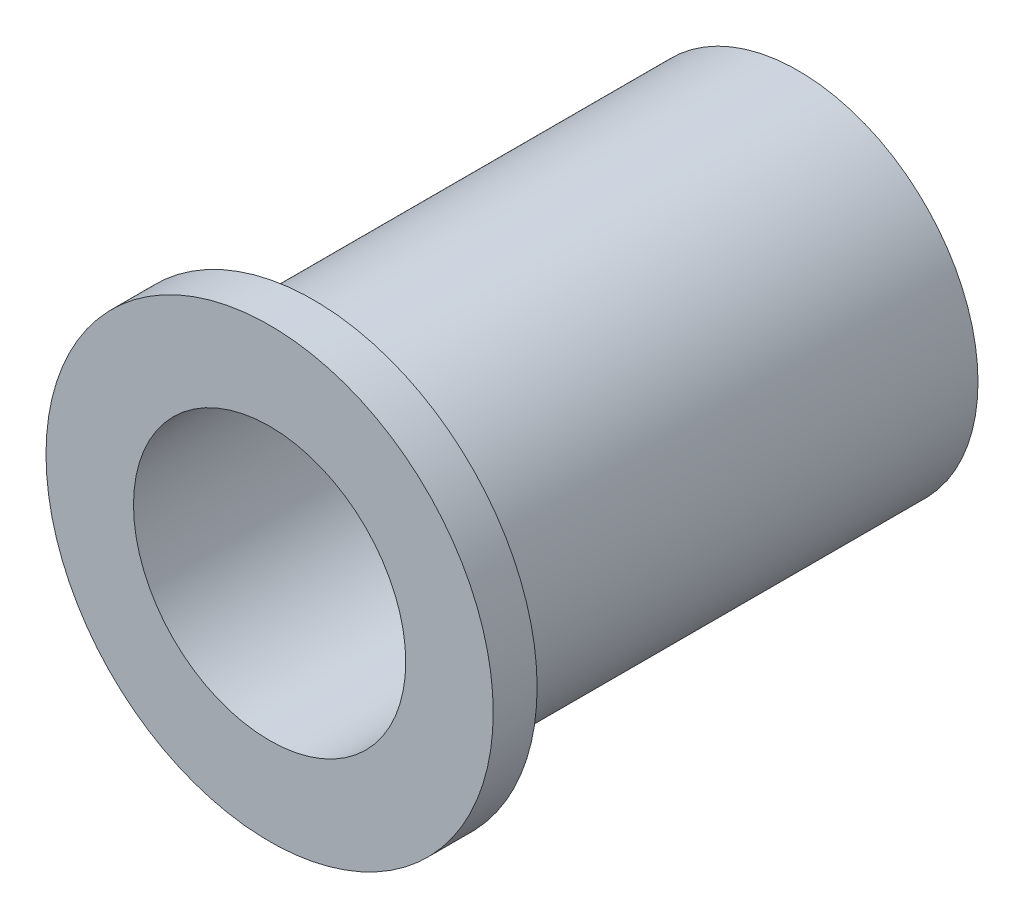
ISO-10303-21;
HEADER;
FILE_DESCRIPTION(('STEP AP214'),'2;1');
FILE_NAME('part.step','',(''),(''),'','','');
FILE_SCHEMA(('AUTOMOTIVE_DESIGN { 1 0 10303 214 1 1 1 1 }'));
ENDSEC;
DATA;
#1=APPLICATION_CONTEXT('core data for automotive mechanical design processes');
#2=APPLICATION_PROTOCOL_DEFINITION('international standard','automotive_design',2000,#1);
#3=PRODUCT_CONTEXT('',#1,'mechanical');
#4=PRODUCT('Part','Part','',(#3));
#5=PRODUCT_RELATED_PRODUCT_CATEGORY('part','',(#4));
#6=PRODUCT_DEFINITION_FORMATION('','',#4);
#7=PRODUCT_DEFINITION_CONTEXT('part definition',#1,'design');
#8=PRODUCT_DEFINITION('design','',#6,#7);
#9=PRODUCT_DEFINITION_SHAPE('','',#8);
#10=(LENGTH_UNIT() NAMED_UNIT(*) SI_UNIT(.MILLI.,.METRE.));
#11=(NAMED_UNIT(*) PLANE_ANGLE_UNIT() SI_UNIT($,.RADIAN.));
#12=(NAMED_UNIT(*) SI_UNIT($,.STERADIAN.) SOLID_ANGLE_UNIT());
#13=UNCERTAINTY_MEASURE_WITH_UNIT(LENGTH_MEASURE(1.E-05),#10,'distance_accuracy_value','');
#14=(GEOMETRIC_REPRESENTATION_CONTEXT(3) GLOBAL_UNCERTAINTY_ASSIGNED_CONTEXT((#13)) GLOBAL_UNIT_ASSIGNED_CONTEXT((#10,
#11,#12)) REPRESENTATION_CONTEXT('',''));
#15=CARTESIAN_POINT('',(0.,0.,0.));
#16=DIRECTION('',(0.,0.,1.));
#17=DIRECTION('',(1.,0.,0.));
#18=AXIS2_PLACEMENT_3D('',#15,#16,#17);
#19=CARTESIAN_POINT('',(0.,0.,-10.));
#20=DIRECTION('',(0.,0.,1.));
#21=DIRECTION('',(1.,0.,0.));
#22=AXIS2_PLACEMENT_3D('',#19,#20,#21);
#23=CYLINDRICAL_SURFACE('',#22,3.4);
#24=CARTESIAN_POINT('',(0.,0.,-2.7));
#25=DIRECTION('',(0.,0.,1.));
#26=DIRECTION('',(1.,0.,0.));
#27=AXIS2_PLACEMENT_3D('',#24,#25,#26);
#28=CIRCLE('',#27,3.4);
#29=CARTESIAN_POINT('',(3.4,0.,-2.7));
#30=VERTEX_POINT('',#29);
#31=EDGE_CURVE('E62',#30,#30,#28,.T.);
#32=ORIENTED_EDGE('',*,*,#31,.T.);
#33=EDGE_LOOP('',(#32));
#34=FACE_BOUND('',#33,.T.);
#35=CARTESIAN_POINT('',(0.,0.,6.47));
#36=DIRECTION('',(0.,0.,1.));
#37=DIRECTION('',(1.,0.,0.));
#38=AXIS2_PLACEMENT_3D('',#35,#36,#37);
#39=CIRCLE('',#38,3.4);
#40=CARTESIAN_POINT('',(3.4,0.,6.47));
#41=VERTEX_POINT('',#40);
#42=EDGE_CURVE('E350',#41,#41,#39,.T.);
#43=ORIENTED_EDGE('',*,*,#42,.F.);
#44=EDGE_LOOP('',(#43));
#45=FACE_BOUND('',#44,.T.);
#46=ADVANCED_FACE('F43',(#34,#45),#23,.T.);
#47=CARTESIAN_POINT('',(-7.99999999999999,0.,0.));
#48=DIRECTION('',(0.,0.,1.));
#49=DIRECTION('',(1.,0.,0.));
#50=AXIS2_PLACEMENT_3D('',#47,#48,#49);
#51=PLANE('',#50);
#52=CARTESIAN_POINT('',(-4.12912203114479E-11,0.,2.27606999878659E-11));
#53=DIRECTION('',(0.,0.,-1.));
#54=DIRECTION('',(-1.,0.,0.));
#55=AXIS2_PLACEMENT_3D('',#52,#53,#54);
#56=CIRCLE('',#55,2.49999999994088);
#57=CARTESIAN_POINT('',(-2.49999999998217,0.,2.27603938261662E-11));
#58=VERTEX_POINT('',#57);
#59=EDGE_CURVE('E50',#58,#58,#56,.T.);
#60=ORIENTED_EDGE('',*,*,#59,.T.);
#61=EDGE_LOOP('',(#60));
#62=FACE_BOUND('',#61,.T.);
#63=CARTESIAN_POINT('',(0.,0.,0.));
#64=DIRECTION('',(0.,0.,1.));
#65=DIRECTION('',(1.,0.,0.));
#66=AXIS2_PLACEMENT_3D('',#63,#64,#65);
#67=CIRCLE('',#66,2.575);
#68=CARTESIAN_POINT('',(2.575,0.,0.));
#69=VERTEX_POINT('',#68);
#70=EDGE_CURVE('E13',#69,#69,#67,.F.);
#71=ORIENTED_EDGE('',*,*,#70,.F.);
#72=EDGE_LOOP('',(#71));
#73=FACE_BOUND('',#72,.T.);
#74=ADVANCED_FACE('F45',(#62,#73),#51,.T.);
#75=CARTESIAN_POINT('',(-7.99999999999999,0.,-2.7));
#76=DIRECTION('',(0.,0.,1.));
#77=DIRECTION('',(1.,0.,0.));
#78=AXIS2_PLACEMENT_3D('',#75,#76,#77);
#79=PLANE('',#78);
#80=CARTESIAN_POINT('',(-4.12908896568121E-11,0.,-2.69999999997724));
#81=DIRECTION('',(0.,0.,-1.));
#82=DIRECTION('',(-1.,0.,0.));
#83=AXIS2_PLACEMENT_3D('',#80,#81,#82);
#84=CIRCLE('',#83,2.50000000004129);
#85=CARTESIAN_POINT('',(-2.50000000008258,0.,-2.69999999997724));
#86=VERTEX_POINT('',#85);
#87=EDGE_CURVE('E54',#86,#86,#84,.T.);
#88=ORIENTED_EDGE('',*,*,#87,.F.);
#89=EDGE_LOOP('',(#88));
#90=FACE_BOUND('',#89,.T.);
#91=ORIENTED_EDGE('',*,*,#31,.F.);
#92=EDGE_LOOP('',(#91));
#93=FACE_BOUND('',#92,.T.);
#94=ADVANCED_FACE('F127',(#90,#93),#79,.F.);
#95=CARTESIAN_POINT('',(-4.12912187561464E-11,0.,-0.0126999999565669));
#96=DIRECTION('',(0.,0.,1.));
#97=DIRECTION('',(1.,0.,0.));
#98=AXIS2_PLACEMENT_3D('',#95,#96,#97);
#99=CONICAL_SURFACE('',#98,2.48186252024745,0.959931089563941);
#100=ORIENTED_EDGE('',*,*,#59,.F.);
#101=EDGE_LOOP('',(#100));
#102=FACE_BOUND('',#101,.T.);
#103=CARTESIAN_POINT('',(-4.12912187561464E-11,0.,-0.0126999999565669));
#104=DIRECTION('',(0.,0.,-1.));
#105=DIRECTION('',(-1.,0.,0.));
#106=AXIS2_PLACEMENT_3D('',#103,#104,#105);
#107=CIRCLE('',#106,2.48186252024745);
#108=CARTESIAN_POINT('',(-2.48186252028874,0.,-0.0126999999565672));
#109=VERTEX_POINT('',#108);
#110=EDGE_CURVE('E64',#109,#109,#107,.T.);
#111=ORIENTED_EDGE('',*,*,#110,.T.);
#112=EDGE_LOOP('',(#111));
#113=FACE_BOUND('',#112,.T.);
#114=ADVANCED_FACE('F123',(#102,#113),#99,.F.);
#115=CARTESIAN_POINT('',(-4.12912203114479E-11,0.,2.27606999878659E-11));
#116=DIRECTION('',(0.,0.,-1.));
#117=DIRECTION('',(-1.,0.,0.));
#118=AXIS2_PLACEMENT_3D('',#115,#116,#117);
#119=CYLINDRICAL_SURFACE('',#118,2.50000000004129);
#120=CARTESIAN_POINT('',(-4.1290892767415E-11,0.,-2.67460000002466));
#121=DIRECTION('',(0.,0.,-1.));
#122=DIRECTION('',(-1.,0.,0.));
#123=AXIS2_PLACEMENT_3D('',#120,#121,#122);
#124=CIRCLE('',#123,2.50000000004129);
#125=CARTESIAN_POINT('',(-2.50000000008258,0.,-2.67460000002466));
#126=VERTEX_POINT('',#125);
#127=EDGE_CURVE('E59',#126,#126,#124,.T.);
#128=ORIENTED_EDGE('',*,*,#127,.F.);
#129=EDGE_LOOP('',(#128));
#130=FACE_BOUND('',#129,.T.);
#131=ORIENTED_EDGE('',*,*,#87,.T.);
#132=EDGE_LOOP('',(#131));
#133=FACE_BOUND('',#132,.T.);
#134=ADVANCED_FACE('F120',(#130,#133),#119,.F.);
#135=CARTESIAN_POINT('',(-4.1290892767415E-11,0.,-2.67460000002466));
#136=DIRECTION('',(0.,0.,-1.));
#137=DIRECTION('',(-1.,0.,0.));
#138=AXIS2_PLACEMENT_3D('',#135,#136,#137);
#139=CONICAL_SURFACE('',#138,2.50000000004129,0.959931088685206);
#140=CARTESIAN_POINT('',(-4.12909270676918E-11,0.,-2.39451698479343));
#141=DIRECTION('',(0.,0.,-1.));
#142=DIRECTION('',(-1.,0.,0.));
#143=AXIS2_PLACEMENT_3D('',#140,#141,#142);
#144=CIRCLE('',#143,2.10000000004129);
#145=CARTESIAN_POINT('',(-2.10000000008258,0.,-2.39451698479343));
#146=VERTEX_POINT('',#145);
#147=EDGE_CURVE('E113',#146,#146,#144,.T.);
#148=ORIENTED_EDGE('',*,*,#147,.F.);
#149=EDGE_LOOP('',(#148));
#150=FACE_BOUND('',#149,.T.);
#151=ORIENTED_EDGE('',*,*,#127,.T.);
#152=EDGE_LOOP('',(#151));
#153=FACE_BOUND('',#152,.T.);
#154=ADVANCED_FACE('F118',(#150,#153),#139,.F.);
#155=CARTESIAN_POINT('',(-4.12912203114479E-11,0.,2.27606999878659E-11));
#156=DIRECTION('',(0.,0.,-1.));
#157=DIRECTION('',(-1.,0.,0.));
#158=AXIS2_PLACEMENT_3D('',#155,#156,#157);
#159=CYLINDRICAL_SURFACE('',#158,2.10000000004129);
#160=CARTESIAN_POINT('',(-4.12909395754956E-11,0.,-2.29238301528389));
#161=DIRECTION('',(0.,0.,-1.));
#162=DIRECTION('',(-1.,0.,0.));
#163=AXIS2_PLACEMENT_3D('',#160,#161,#162);
#164=CIRCLE('',#163,2.10000000004129);
#165=CARTESIAN_POINT('',(-2.10000000008258,0.,-2.29238301528389));
#166=VERTEX_POINT('',#165);
#167=EDGE_CURVE('E110',#166,#166,#164,.T.);
#168=ORIENTED_EDGE('',*,*,#167,.F.);
#169=EDGE_LOOP('',(#168));
#170=FACE_BOUND('',#169,.T.);
#171=ORIENTED_EDGE('',*,*,#147,.T.);
#172=EDGE_LOOP('',(#171));
#173=FACE_BOUND('',#172,.T.);
#174=ADVANCED_FACE('F188',(#170,#173),#159,.F.);
#175=CARTESIAN_POINT('',(-4.12909395754956E-11,0.,-2.29238301528389));
#176=DIRECTION('',(0.,0.,1.));
#177=DIRECTION('',(1.,0.,0.));
#178=AXIS2_PLACEMENT_3D('',#175,#176,#177);
#179=CONICAL_SURFACE('',#178,2.10000000004129,0.959931088655895);
#180=CARTESIAN_POINT('',(-4.12909738757725E-11,0.,-2.01230000008651));
#181=DIRECTION('',(0.,0.,-1.));
#182=DIRECTION('',(-1.,0.,0.));
#183=AXIS2_PLACEMENT_3D('',#180,#181,#182);
#184=CIRCLE('',#183,2.49999999996799);
#185=CARTESIAN_POINT('',(-2.50000000000928,0.,-2.01230000008651));
#186=VERTEX_POINT('',#185);
#187=EDGE_CURVE('E107',#186,#186,#184,.T.);
#188=ORIENTED_EDGE('',*,*,#187,.F.);
#189=EDGE_LOOP('',(#188));
#190=FACE_BOUND('',#189,.T.);
#191=ORIENTED_EDGE('',*,*,#167,.T.);
#192=EDGE_LOOP('',(#191));
#193=FACE_BOUND('',#192,.T.);
#194=ADVANCED_FACE('F184',(#190,#193),#179,.F.);
#195=CARTESIAN_POINT('',(-4.12909738757725E-11,0.,-2.01230000008651));
#196=DIRECTION('',(0.,0.,-1.));
#197=DIRECTION('',(-1.,0.,0.));
#198=AXIS2_PLACEMENT_3D('',#195,#196,#197);
#199=CONICAL_SURFACE('',#198,2.49999999996799,0.959931088420655);
#200=CARTESIAN_POINT('',(-4.12910081760493E-11,0.,-1.7322169847489));
#201=DIRECTION('',(0.,0.,-1.));
#202=DIRECTION('',(-1.,0.,0.));
#203=AXIS2_PLACEMENT_3D('',#200,#201,#202);
#204=CIRCLE('',#203,2.10000000004129);
#205=CARTESIAN_POINT('',(-2.10000000008258,0.,-1.7322169847489));
#206=VERTEX_POINT('',#205);
#207=EDGE_CURVE('E104',#206,#206,#204,.T.);
#208=ORIENTED_EDGE('',*,*,#207,.F.);
#209=EDGE_LOOP('',(#208));
#210=FACE_BOUND('',#209,.T.);
#211=ORIENTED_EDGE('',*,*,#187,.T.);
#212=EDGE_LOOP('',(#211));
#213=FACE_BOUND('',#212,.T.);
#214=ADVANCED_FACE('F180',(#210,#213),#199,.F.);
#215=CARTESIAN_POINT('',(-4.12912203114479E-11,0.,2.27606999878659E-11));
#216=DIRECTION('',(0.,0.,-1.));
#217=DIRECTION('',(-1.,0.,0.));
#218=AXIS2_PLACEMENT_3D('',#215,#216,#217);
#219=CYLINDRICAL_SURFACE('',#218,2.10000000004129);
#220=CARTESIAN_POINT('',(-4.12910206838532E-11,0.,-1.63008301528389));
#221=DIRECTION('',(0.,0.,-1.));
#222=DIRECTION('',(-1.,0.,0.));
#223=AXIS2_PLACEMENT_3D('',#220,#221,#222);
#224=CIRCLE('',#223,2.10000000004129);
#225=CARTESIAN_POINT('',(-2.10000000008258,0.,-1.63008301528389));
#226=VERTEX_POINT('',#225);
#227=EDGE_CURVE('E101',#226,#226,#224,.T.);
#228=ORIENTED_EDGE('',*,*,#227,.F.);
#229=EDGE_LOOP('',(#228));
#230=FACE_BOUND('',#229,.T.);
#231=ORIENTED_EDGE('',*,*,#207,.T.);
#232=EDGE_LOOP('',(#231));
#233=FACE_BOUND('',#232,.T.);
#234=ADVANCED_FACE('F176',(#230,#233),#219,.F.);
#235=CARTESIAN_POINT('',(-4.12910206838532E-11,0.,-1.63008301528389));
#236=DIRECTION('',(0.,0.,1.));
#237=DIRECTION('',(1.,0.,0.));
#238=AXIS2_PLACEMENT_3D('',#235,#236,#237);
#239=CONICAL_SURFACE('',#238,2.10000000004129,0.959931088484176);
#240=CARTESIAN_POINT('',(-4.129105498413E-11,0.,-1.35000000001922));
#241=DIRECTION('',(0.,0.,-1.));
#242=DIRECTION('',(-1.,0.,0.));
#243=AXIS2_PLACEMENT_3D('',#240,#241,#242);
#244=CIRCLE('',#243,2.49999999991789);
#245=CARTESIAN_POINT('',(-2.49999999995918,0.,-1.35000000001922));
#246=VERTEX_POINT('',#245);
#247=EDGE_CURVE('E98',#246,#246,#244,.T.);
#248=ORIENTED_EDGE('',*,*,#247,.F.);
#249=EDGE_LOOP('',(#248));
#250=FACE_BOUND('',#249,.T.);
#251=ORIENTED_EDGE('',*,*,#227,.T.);
#252=EDGE_LOOP('',(#251));
#253=FACE_BOUND('',#252,.T.);
#254=ADVANCED_FACE('F172',(#250,#253),#239,.F.);
#255=CARTESIAN_POINT('',(-4.129105498413E-11,0.,-1.35000000001922));
#256=DIRECTION('',(0.,0.,-1.));
#257=DIRECTION('',(-1.,0.,0.));
#258=AXIS2_PLACEMENT_3D('',#255,#256,#257);
#259=CONICAL_SURFACE('',#258,2.49999999991789,0.959931088495347);
#260=CARTESIAN_POINT('',(-4.12910892844068E-11,0.,-1.06991698476122));
#261=DIRECTION('',(0.,0.,-1.));
#262=DIRECTION('',(-1.,0.,0.));
#263=AXIS2_PLACEMENT_3D('',#260,#261,#262);
#264=CIRCLE('',#263,2.10000000004129);
#265=CARTESIAN_POINT('',(-2.10000000008258,0.,-1.06991698476122));
#266=VERTEX_POINT('',#265);
#267=EDGE_CURVE('E95',#266,#266,#264,.T.);
#268=ORIENTED_EDGE('',*,*,#267,.F.);
#269=EDGE_LOOP('',(#268));
#270=FACE_BOUND('',#269,.T.);
#271=ORIENTED_EDGE('',*,*,#247,.T.);
#272=EDGE_LOOP('',(#271));
#273=FACE_BOUND('',#272,.T.);
#274=ADVANCED_FACE('F168',(#270,#273),#259,.F.);
#275=CARTESIAN_POINT('',(-4.12912203114479E-11,0.,2.27606999878659E-11));
#276=DIRECTION('',(0.,0.,-1.));
#277=DIRECTION('',(-1.,0.,0.));
#278=AXIS2_PLACEMENT_3D('',#275,#276,#277);
#279=CYLINDRICAL_SURFACE('',#278,2.10000000004129);
#280=CARTESIAN_POINT('',(-4.12911017922107E-11,0.,-0.967783015283888));
#281=DIRECTION('',(0.,0.,-1.));
#282=DIRECTION('',(-1.,0.,0.));
#283=AXIS2_PLACEMENT_3D('',#280,#281,#282);
#284=CIRCLE('',#283,2.10000000004129);
#285=CARTESIAN_POINT('',(-2.10000000008258,0.,-0.967783015283888));
#286=VERTEX_POINT('',#285);
#287=EDGE_CURVE('E92',#286,#286,#284,.T.);
#288=ORIENTED_EDGE('',*,*,#287,.F.);
#289=EDGE_LOOP('',(#288));
#290=FACE_BOUND('',#289,.T.);
#291=ORIENTED_EDGE('',*,*,#267,.T.);
#292=EDGE_LOOP('',(#291));
#293=FACE_BOUND('',#292,.T.);
#294=ADVANCED_FACE('F164',(#290,#293),#279,.F.);
#295=CARTESIAN_POINT('',(-4.12911017922107E-11,0.,-0.967783015283888));
#296=DIRECTION('',(0.,0.,1.));
#297=DIRECTION('',(1.,0.,0.));
#298=AXIS2_PLACEMENT_3D('',#295,#296,#297);
#299=CONICAL_SURFACE('',#298,2.10000000004129,0.959931088655895);
#300=CARTESIAN_POINT('',(-4.12911360924875E-11,0.,-0.687700000071346));
#301=DIRECTION('',(0.,0.,-1.));
#302=DIRECTION('',(-1.,0.,0.));
#303=AXIS2_PLACEMENT_3D('',#300,#301,#302);
#304=CIRCLE('',#303,2.49999999998965);
#305=CARTESIAN_POINT('',(-2.50000000003094,0.,-0.687700000071346));
#306=VERTEX_POINT('',#305);
#307=EDGE_CURVE('E89',#306,#306,#304,.T.);
#308=ORIENTED_EDGE('',*,*,#307,.F.);
#309=EDGE_LOOP('',(#308));
#310=FACE_BOUND('',#309,.T.);
#311=ORIENTED_EDGE('',*,*,#287,.T.);
#312=EDGE_LOOP('',(#311));
#313=FACE_BOUND('',#312,.T.);
#314=ADVANCED_FACE('F160',(#310,#313),#299,.F.);
#315=CARTESIAN_POINT('',(-4.12911360924875E-11,0.,-0.687700000071346));
#316=DIRECTION('',(0.,0.,-1.));
#317=DIRECTION('',(-1.,0.,0.));
#318=AXIS2_PLACEMENT_3D('',#315,#316,#317);
#319=CONICAL_SURFACE('',#318,2.49999999998965,0.959931088416545);
#320=CARTESIAN_POINT('',(-4.12911703927643E-11,0.,-0.407616984716123));
#321=DIRECTION('',(0.,0.,-1.));
#322=DIRECTION('',(-1.,0.,0.));
#323=AXIS2_PLACEMENT_3D('',#320,#321,#322);
#324=CIRCLE('',#323,2.10000000004129);
#325=CARTESIAN_POINT('',(-2.10000000008258,0.,-0.407616984716123));
#326=VERTEX_POINT('',#325);
#327=EDGE_CURVE('E86',#326,#326,#324,.T.);
#328=ORIENTED_EDGE('',*,*,#327,.F.);
#329=EDGE_LOOP('',(#328));
#330=FACE_BOUND('',#329,.T.);
#331=ORIENTED_EDGE('',*,*,#307,.T.);
#332=EDGE_LOOP('',(#331));
#333=FACE_BOUND('',#332,.T.);
#334=ADVANCED_FACE('F156',(#330,#333),#319,.F.);
#335=CARTESIAN_POINT('',(-4.12912203114479E-11,0.,2.27606999878659E-11));
#336=DIRECTION('',(0.,0.,-1.));
#337=DIRECTION('',(-1.,0.,0.));
#338=AXIS2_PLACEMENT_3D('',#335,#336,#337);
#339=CYLINDRICAL_SURFACE('',#338,2.10000000004129);
#340=CARTESIAN_POINT('',(-4.12911829005682E-11,0.,-0.305483015267782));
#341=DIRECTION('',(0.,0.,-1.));
#342=DIRECTION('',(-1.,0.,0.));
#343=AXIS2_PLACEMENT_3D('',#340,#341,#342);
#344=CIRCLE('',#343,2.10000000004129);
#345=CARTESIAN_POINT('',(-2.10000000008258,0.,-0.305483015267783));
#346=VERTEX_POINT('',#345);
#347=EDGE_CURVE('E83',#346,#346,#344,.T.);
#348=ORIENTED_EDGE('',*,*,#347,.F.);
#349=EDGE_LOOP('',(#348));
#350=FACE_BOUND('',#349,.T.);
#351=ORIENTED_EDGE('',*,*,#327,.T.);
#352=EDGE_LOOP('',(#351));
#353=FACE_BOUND('',#352,.T.);
#354=ADVANCED_FACE('F152',(#350,#353),#339,.F.);
#355=CARTESIAN_POINT('',(-4.12911829005682E-11,0.,-0.305483015267782));
#356=DIRECTION('',(0.,0.,1.));
#357=DIRECTION('',(1.,0.,0.));
#358=AXIS2_PLACEMENT_3D('',#355,#356,#357);
#359=CONICAL_SURFACE('',#358,2.10000000004129,0.959931088713069);
#360=CARTESIAN_POINT('',(-4.1291217200845E-11,0.,-0.0254000000836643));
#361=DIRECTION('',(0.,0.,-1.));
#362=DIRECTION('',(-1.,0.,0.));
#363=AXIS2_PLACEMENT_3D('',#360,#361,#362);
#364=CIRCLE('',#363,2.49999999999773);
#365=CARTESIAN_POINT('',(-2.50000000003902,0.,-0.0254000000836646));
#366=VERTEX_POINT('',#365);
#367=EDGE_CURVE('E69',#366,#366,#364,.T.);
#368=ORIENTED_EDGE('',*,*,#367,.F.);
#369=EDGE_LOOP('',(#368));
#370=FACE_BOUND('',#369,.T.);
#371=ORIENTED_EDGE('',*,*,#347,.T.);
#372=EDGE_LOOP('',(#371));
#373=FACE_BOUND('',#372,.T.);
#374=ADVANCED_FACE('F148',(#370,#373),#359,.F.);
#375=CARTESIAN_POINT('',(-4.1291217200845E-11,0.,-0.0254000000836643));
#376=DIRECTION('',(0.,0.,-1.));
#377=DIRECTION('',(-1.,0.,0.));
#378=AXIS2_PLACEMENT_3D('',#375,#376,#377);
#379=CONICAL_SURFACE('',#378,2.49999999999773,0.959931085569598);
#380=ORIENTED_EDGE('',*,*,#110,.F.);
#381=EDGE_LOOP('',(#380));
#382=FACE_BOUND('',#381,.T.);
#383=ORIENTED_EDGE('',*,*,#367,.T.);
#384=EDGE_LOOP('',(#383));
#385=FACE_BOUND('',#384,.T.);
#386=ADVANCED_FACE('F145',(#382,#385),#379,.F.);
#387=CARTESIAN_POINT('',(0.,0.,7.3));
#388=DIRECTION('',(0.,0.,1.));
#389=DIRECTION('',(1.,0.,0.));
#390=AXIS2_PLACEMENT_3D('',#387,#388,#389);
#391=PLANE('',#390);
#392=CARTESIAN_POINT('',(0.,0.,7.3));
#393=DIRECTION('',(0.,0.,1.));
#394=DIRECTION('',(1.,0.,0.));
#395=AXIS2_PLACEMENT_3D('',#392,#393,#394);
#396=CIRCLE('',#395,2.575);
#397=CARTESIAN_POINT('',(2.575,0.,7.3));
#398=VERTEX_POINT('',#397);
#399=EDGE_CURVE('E65',#398,#398,#396,.T.);
#400=ORIENTED_EDGE('',*,*,#399,.F.);
#401=EDGE_LOOP('',(#400));
#402=FACE_BOUND('',#401,.T.);
#403=CARTESIAN_POINT('',(0.,0.,7.3));
#404=DIRECTION('',(0.,0.,1.));
#405=DIRECTION('',(1.,0.,0.));
#406=AXIS2_PLACEMENT_3D('',#403,#404,#405);
#407=CIRCLE('',#406,4.23);
#408=CARTESIAN_POINT('',(4.23,0.,7.3));
#409=VERTEX_POINT('',#408);
#410=EDGE_CURVE('E77',#409,#409,#407,.T.);
#411=ORIENTED_EDGE('',*,*,#410,.T.);
#412=EDGE_LOOP('',(#411));
#413=FACE_BOUND('',#412,.T.);
#414=ADVANCED_FACE('F143',(#402,#413),#391,.T.);
#415=CARTESIAN_POINT('',(0.,0.,7.3));
#416=DIRECTION('',(0.,0.,-1.));
#417=DIRECTION('',(-1.,0.,0.));
#418=AXIS2_PLACEMENT_3D('',#415,#416,#417);
#419=CYLINDRICAL_SURFACE('',#418,2.575);
#420=ORIENTED_EDGE('',*,*,#399,.T.);
#421=EDGE_LOOP('',(#420));
#422=FACE_BOUND('',#421,.T.);
#423=ORIENTED_EDGE('',*,*,#70,.T.);
#424=EDGE_LOOP('',(#423));
#425=FACE_BOUND('',#424,.T.);
#426=ADVANCED_FACE('F255',(#422,#425),#419,.F.);
#427=CARTESIAN_POINT('',(0.,0.,6.47));
#428=DIRECTION('',(0.,0.,1.));
#429=DIRECTION('',(1.,0.,0.));
#430=AXIS2_PLACEMENT_3D('',#427,#428,#429);
#431=CYLINDRICAL_SURFACE('',#430,4.23);
#432=CARTESIAN_POINT('',(0.,0.,6.47));
#433=DIRECTION('',(0.,0.,1.));
#434=DIRECTION('',(1.,0.,0.));
#435=AXIS2_PLACEMENT_3D('',#432,#433,#434);
#436=CIRCLE('',#435,4.23);
#437=CARTESIAN_POINT('',(4.23,0.,6.47));
#438=VERTEX_POINT('',#437);
#439=EDGE_CURVE('E72',#438,#438,#436,.T.);
#440=CARTESIAN_POINT('',(4.23,0.,6.47));
#441=CARTESIAN_POINT('',(4.23,0.,6.47864583333333));
#442=CARTESIAN_POINT('',(4.23,0.,6.48729166666667));
#443=CARTESIAN_POINT('',(4.23,0.,6.50458333333333));
#444=CARTESIAN_POINT('',(4.23,0.,6.51322916666667));
#445=CARTESIAN_POINT('',(4.23,0.,6.53052083333333));
#446=CARTESIAN_POINT('',(4.23,0.,6.53916666666667));
#447=CARTESIAN_POINT('',(4.23,0.,6.55645833333333));
#448=CARTESIAN_POINT('',(4.23,0.,6.56510416666667));
#449=CARTESIAN_POINT('',(4.23,0.,6.58239583333333));
#450=CARTESIAN_POINT('',(4.23,0.,6.59104166666667));
#451=CARTESIAN_POINT('',(4.23,0.,6.60833333333333));
#452=CARTESIAN_POINT('',(4.23,0.,6.61697916666667));
#453=CARTESIAN_POINT('',(4.23,0.,6.63427083333333));
#454=CARTESIAN_POINT('',(4.23,0.,6.64291666666667));
#455=CARTESIAN_POINT('',(4.23,0.,6.66020833333333));
#456=CARTESIAN_POINT('',(4.23,0.,6.66885416666667));
#457=CARTESIAN_POINT('',(4.23,0.,6.68614583333333));
#458=CARTESIAN_POINT('',(4.23,0.,6.69479166666667));
#459=CARTESIAN_POINT('',(4.23,0.,6.71208333333333));
#460=CARTESIAN_POINT('',(4.23,0.,6.72072916666667));
#461=CARTESIAN_POINT('',(4.23,0.,6.73802083333333));
#462=CARTESIAN_POINT('',(4.23,0.,6.74666666666667));
#463=CARTESIAN_POINT('',(4.23,0.,6.76395833333333));
#464=CARTESIAN_POINT('',(4.23,0.,6.77260416666667));
#465=CARTESIAN_POINT('',(4.23,0.,6.78989583333333));
#466=CARTESIAN_POINT('',(4.23,0.,6.79854166666667));
#467=CARTESIAN_POINT('',(4.23,0.,6.81583333333333));
#468=CARTESIAN_POINT('',(4.23,0.,6.82447916666667));
#469=CARTESIAN_POINT('',(4.23,0.,6.84177083333333));
#470=CARTESIAN_POINT('',(4.23,0.,6.85041666666667));
#471=CARTESIAN_POINT('',(4.23,0.,6.86770833333333));
#472=CARTESIAN_POINT('',(4.23,0.,6.87635416666667));
#473=CARTESIAN_POINT('',(4.23,0.,6.89364583333333));
#474=CARTESIAN_POINT('',(4.23,0.,6.90229166666667));
#475=CARTESIAN_POINT('',(4.23,0.,6.91958333333333));
#476=CARTESIAN_POINT('',(4.23,0.,6.92822916666667));
#477=CARTESIAN_POINT('',(4.23,0.,6.94552083333333));
#478=CARTESIAN_POINT('',(4.23,0.,6.95416666666667));
#479=CARTESIAN_POINT('',(4.23,0.,6.97145833333333));
#480=CARTESIAN_POINT('',(4.23,0.,6.98010416666667));
#481=CARTESIAN_POINT('',(4.23,0.,6.99739583333333));
#482=CARTESIAN_POINT('',(4.23,0.,7.00604166666667));
#483=CARTESIAN_POINT('',(4.23,0.,7.02333333333333));
#484=CARTESIAN_POINT('',(4.23,0.,7.03197916666667));
#485=CARTESIAN_POINT('',(4.23,0.,7.04927083333333));
#486=CARTESIAN_POINT('',(4.23,0.,7.05791666666667));
#487=CARTESIAN_POINT('',(4.23,0.,7.07520833333333));
#488=CARTESIAN_POINT('',(4.23,0.,7.08385416666667));
#489=CARTESIAN_POINT('',(4.23,0.,7.10114583333333));
#490=CARTESIAN_POINT('',(4.23,0.,7.10979166666667));
#491=CARTESIAN_POINT('',(4.23,0.,7.12708333333333));
#492=CARTESIAN_POINT('',(4.23,0.,7.13572916666667));
#493=CARTESIAN_POINT('',(4.23,0.,7.15302083333333));
#494=CARTESIAN_POINT('',(4.23,0.,7.16166666666667));
#495=CARTESIAN_POINT('',(4.23,0.,7.17895833333333));
#496=CARTESIAN_POINT('',(4.23,0.,7.18760416666667));
#497=CARTESIAN_POINT('',(4.23,0.,7.20489583333333));
#498=CARTESIAN_POINT('',(4.23,0.,7.21354166666667));
#499=CARTESIAN_POINT('',(4.23,0.,7.23083333333333));
#500=CARTESIAN_POINT('',(4.23,0.,7.23947916666667));
#501=CARTESIAN_POINT('',(4.23,0.,7.25677083333333));
#502=CARTESIAN_POINT('',(4.23,0.,7.26541666666667));
#503=CARTESIAN_POINT('',(4.23,0.,7.28270833333333));
#504=CARTESIAN_POINT('',(4.23,0.,7.29135416666667));
#505=CARTESIAN_POINT('',(4.23,0.,7.3));
#506=B_SPLINE_CURVE_WITH_KNOTS('',3,(#440,#441,#442,#443,#444,#445,#446,#447,#448,#449,#450,
#451,#452,#453,#454,#455,#456,#457,#458,#459,#460,#461,#462,#463,#464,#465,#466,#467,#468,#469,
#470,#471,#472,#473,#474,#475,#476,#477,#478,#479,#480,#481,#482,#483,#484,#485,#486,#487,#488,
#489,#490,#491,#492,#493,#494,#495,#496,#497,#498,#499,#500,#501,#502,#503,#504,#505),
.UNSPECIFIED.,.F.,.F.,(4,2,2,2,2,2,2,2,2,2,2,2,2,2,2,2,2,2,2,2,2,2,2,2,2,2,2,2,2,2,2,2,4),(0.,
0.0259374999999999,0.0518749999999998,0.0778124999999998,0.10375,0.1296875,0.155625,
0.181562499999999,0.207499999999999,0.233437499999999,0.259374999999999,0.2853125,0.31125,
0.3371875,0.363125,0.3890625,0.415,0.440937499999999,0.466874999999999,0.492812499999999,
0.518749999999999,0.5446875,0.570625,0.5965625,0.6225,0.6484375,0.674375,0.7003125,0.72625,
0.752187499999999,0.778124999999999,0.804062499999999,0.83),.UNSPECIFIED.);
#507=EDGE_CURVE('BSEAM263',#438,#409,#506,.T.);
#508=ORIENTED_EDGE('',*,*,#439,.T.);
#509=ORIENTED_EDGE('',*,*,#410,.F.);
#510=ORIENTED_EDGE('',*,*,#507,.T.);
#511=ORIENTED_EDGE('',*,*,#507,.F.);
#512=EDGE_LOOP('',(#508,#510,#509,#511));
#513=FACE_BOUND('',#512,.T.);
#514=ADVANCED_FACE('F263',(#513),#431,.T.);
#515=CARTESIAN_POINT('',(0.,0.,6.47));
#516=DIRECTION('',(0.,0.,1.));
#517=DIRECTION('',(1.,0.,0.));
#518=AXIS2_PLACEMENT_3D('',#515,#516,#517);
#519=PLANE('',#518);
#520=ORIENTED_EDGE('',*,*,#42,.T.);
#521=EDGE_LOOP('',(#520));
#522=FACE_BOUND('',#521,.T.);
#523=ORIENTED_EDGE('',*,*,#439,.F.);
#524=EDGE_LOOP('',(#523));
#525=FACE_BOUND('',#524,.T.);
#526=ADVANCED_FACE('F269',(#522,#525),#519,.F.);
#527=CLOSED_SHELL('',(#46,#74,#94,#114,#134,#154,#174,#194,#214,#234,#254,#274,#294,#314,#334,
#354,#374,#386,#414,#426,#514,#526));
#528=MANIFOLD_SOLID_BREP('B2',#527);
#529=ADVANCED_BREP_SHAPE_REPRESENTATION('',(#18,#528),#14);
#530=SHAPE_DEFINITION_REPRESENTATION(#9,#529);
ENDSEC;
END-ISO-10303-21;
